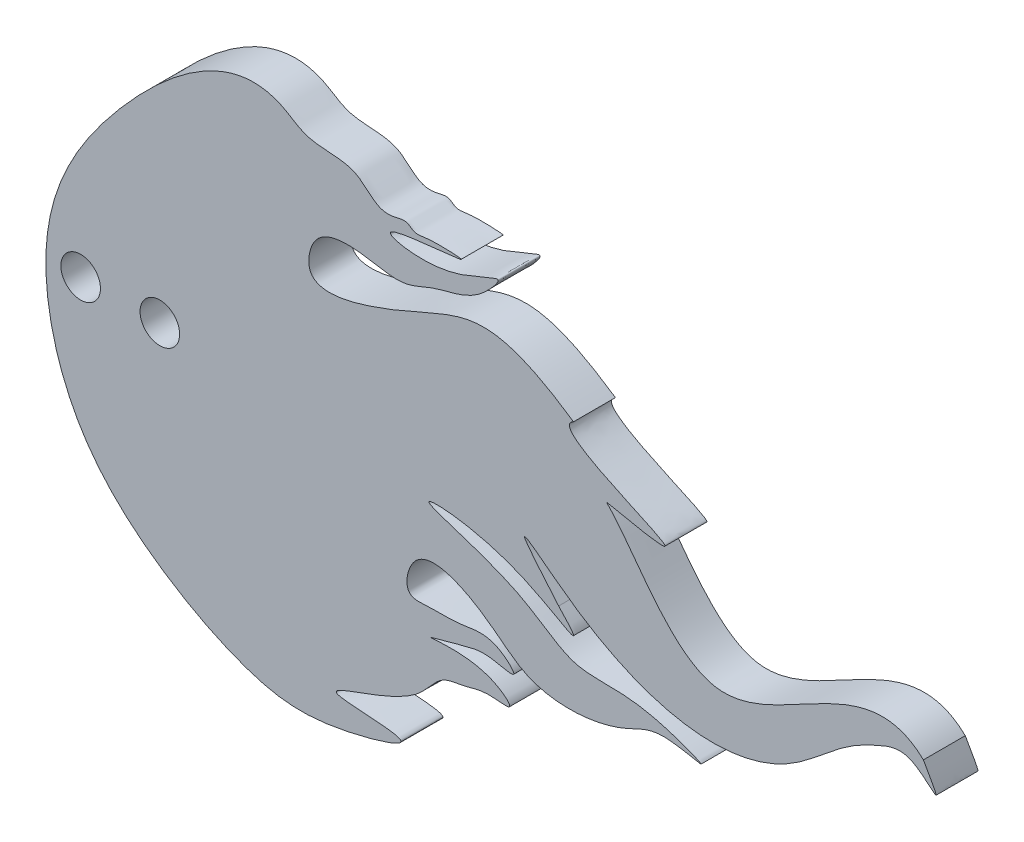
ISO-10303-21;
HEADER;
FILE_DESCRIPTION(('STEP AP214'),'2;1');
FILE_NAME('part.step','',(''),(''),'','','');
FILE_SCHEMA(('AUTOMOTIVE_DESIGN { 1 0 10303 214 1 1 1 1 }'));
ENDSEC;
DATA;
#1=APPLICATION_CONTEXT('core data for automotive mechanical design processes');
#2=APPLICATION_PROTOCOL_DEFINITION('international standard','automotive_design',2000,#1);
#3=PRODUCT_CONTEXT('',#1,'mechanical');
#4=PRODUCT('Part','Part','',(#3));
#5=PRODUCT_RELATED_PRODUCT_CATEGORY('part','',(#4));
#6=PRODUCT_DEFINITION_FORMATION('','',#4);
#7=PRODUCT_DEFINITION_CONTEXT('part definition',#1,'design');
#8=PRODUCT_DEFINITION('design','',#6,#7);
#9=PRODUCT_DEFINITION_SHAPE('','',#8);
#10=(LENGTH_UNIT() NAMED_UNIT(*) SI_UNIT(.MILLI.,.METRE.));
#11=(NAMED_UNIT(*) PLANE_ANGLE_UNIT() SI_UNIT($,.RADIAN.));
#12=(NAMED_UNIT(*) SI_UNIT($,.STERADIAN.) SOLID_ANGLE_UNIT());
#13=UNCERTAINTY_MEASURE_WITH_UNIT(LENGTH_MEASURE(1.E-05),#10,'distance_accuracy_value','');
#14=(GEOMETRIC_REPRESENTATION_CONTEXT(3) GLOBAL_UNCERTAINTY_ASSIGNED_CONTEXT((#13)) GLOBAL_UNIT_ASSIGNED_CONTEXT((#10,
#11,#12)) REPRESENTATION_CONTEXT('',''));
#15=CARTESIAN_POINT('',(0.,0.,0.));
#16=DIRECTION('',(0.,0.,1.));
#17=DIRECTION('',(1.,0.,0.));
#18=AXIS2_PLACEMENT_3D('',#15,#16,#17);
#19=CARTESIAN_POINT('',(41.3549220080931,31.0230299699767,3.175));
#20=CARTESIAN_POINT('',(33.9720440539472,36.0530782339666,3.175));
#21=CARTESIAN_POINT('',(32.2977858198941,32.3565667105754,3.175));
#22=CARTESIAN_POINT('',(20.7696091372768,29.4457621228848,3.175));
#23=CARTESIAN_POINT('',(21.67810284336,34.2387747048186,3.175));
#24=CARTESIAN_POINT('',(25.4705528282111,34.1586736266601,3.175));
#25=CARTESIAN_POINT('',(28.3802173133292,33.367358419093,3.175));
#26=CARTESIAN_POINT('',(31.2449201130264,34.8743214604512,3.175));
#27=CARTESIAN_POINT('',(33.7163564911668,34.9731184821858,3.175));
#28=CARTESIAN_POINT('',(36.7189586217149,38.5150338629654,3.175));
#29=CARTESIAN_POINT('',(31.9136759152894,35.1994476442837,3.175));
#30=CARTESIAN_POINT('',(23.840142357921,36.8363912281645,3.175));
#31=CARTESIAN_POINT('',(35.2317906731922,37.3958661374964,3.175));
#32=CARTESIAN_POINT('',(31.1121299670091,37.5731809720246,3.175));
#33=CARTESIAN_POINT('',(30.0870459585164,37.4927941471804,3.175));
#34=CARTESIAN_POINT('',(29.262914377226,37.3512130056213,3.175));
#35=CARTESIAN_POINT('',(28.7032376060159,37.9507838012107,3.175));
#36=CARTESIAN_POINT('',(27.8129680444021,37.63302882079,3.175));
#37=CARTESIAN_POINT('',(26.3919079587829,37.5724257438123,3.175));
#38=CARTESIAN_POINT('',(24.705374407945,39.8739670695336,3.175));
#39=CARTESIAN_POINT('',(21.5600526992188,39.0979909637939,3.175));
#40=CARTESIAN_POINT('',(16.0399752336877,43.3008027237849,3.175));
#41=CARTESIAN_POINT('',(5.89122312531113,34.5285652229111,3.175));
#42=CARTESIAN_POINT('',(-0.00240369593507275,23.7599733988015,3.175));
#43=CARTESIAN_POINT('',(2.85710311505319,11.8466909848685,3.175));
#44=CARTESIAN_POINT('',(9.70473696119852,5.59672963324414,3.175));
#45=CARTESIAN_POINT('',(17.316174360177,1.75354544030165,3.175));
#46=CARTESIAN_POINT('',(22.2736770865761,1.38042875022355,3.175));
#47=CARTESIAN_POINT('',(31.0703199080442,3.99661371001944,3.175));
#48=CARTESIAN_POINT('',(19.0096039411179,3.86886350999444,3.175));
#49=CARTESIAN_POINT('',(29.5744389498898,5.9489149230017,3.175));
#50=CARTESIAN_POINT('',(30.9822049992327,9.26964092371762,3.175));
#51=CARTESIAN_POINT('',(33.3009773503853,9.5034118260375,3.175));
#52=CARTESIAN_POINT('',(34.516397419071,10.0919151066659,3.175));
#53=CARTESIAN_POINT('',(37.1849027171738,9.58748141397212,3.175));
#54=CARTESIAN_POINT('',(34.1781713021411,12.1713205237161,3.175));
#55=CARTESIAN_POINT('',(28.4735499304611,10.9559290241157,3.175));
#56=CARTESIAN_POINT('',(33.215600837273,12.1927392507583,3.175));
#57=CARTESIAN_POINT('',(34.6396195638015,12.6177611472723,3.175));
#58=CARTESIAN_POINT('',(37.5011996664773,11.7934793707428,3.175));
#59=CARTESIAN_POINT('',(35.1052175920869,14.0541095439786,3.175));
#60=CARTESIAN_POINT('',(32.9243821249428,13.3096666432512,3.175));
#61=CARTESIAN_POINT('',(30.7903087589449,13.4499512962252,3.175));
#62=CARTESIAN_POINT('',(28.4194046228156,13.210471391216,3.175));
#63=CARTESIAN_POINT('',(29.2366405608638,17.7622030526873,3.175));
#64=CARTESIAN_POINT('',(34.6630047098513,15.2421855193383,3.175));
#65=CARTESIAN_POINT('',(38.3124610902389,11.5137679732903,3.175));
#66=CARTESIAN_POINT('',(44.2412164561711,11.9898140679571,3.175));
#67=CARTESIAN_POINT('',(47.7063494970929,14.2404051161629,3.175));
#68=CARTESIAN_POINT('',(52.9856164055338,12.7289828090862,3.175));
#69=CARTESIAN_POINT('',(45.6940885031656,15.6237018375215,3.175));
#70=CARTESIAN_POINT('',(41.4365579407384,14.3915709918011,3.175));
#71=CARTESIAN_POINT('',(37.1402076469705,18.3887441245213,3.175));
#72=CARTESIAN_POINT('',(26.6610542955725,20.8177272345052,3.175));
#73=CARTESIAN_POINT('',(37.2288003692225,20.1929252837264,3.175));
#74=CARTESIAN_POINT('',(42.9710442433009,15.479813331642,3.175));
#75=CARTESIAN_POINT('',(40.2270863242686,18.3679304480101,3.175));
#76=B_SPLINE_CURVE_WITH_KNOTS('',3,(#19,#20,#21,#22,#23,#24,#25,#26,#27,#28,#29,#30,#31,#32,#33,
#34,#35,#36,#37,#38,#39,#40,#41,#42,#43,#44,#45,#46,#47,#48,#49,#50,#51,#52,#53,#54,#55,#56,#57,
#58,#59,#60,#61,#62,#63,#64,#65,#66,#67,#68,#69,#70,#71,#72,#73,#74,#75),.UNSPECIFIED.,.F.,.F.,
(4,1,1,1,1,1,1,1,1,1,1,1,1,1,1,1,1,1,1,1,1,1,1,1,1,1,1,1,1,1,1,1,1,1,1,1,1,1,1,1,1,1,1,1,1,1,1,
1,1,1,1,1,1,1,4),(0.,0.0684601973403676,0.0896618004127666,0.0987865660196648,0.115937564923483,
0.128955727329369,0.138030154691066,0.155343597620779,0.163568502325599,0.180092593587653,
0.199293826955547,0.222145101348247,0.230007495519871,0.234460379079716,0.237192543711568,
0.239945970645665,0.243718188735315,0.248157956262074,0.257726629111863,0.275475844929727,
0.283271197093495,0.343295321312501,0.398607826843988,0.44746178860544,0.485376725896982,
0.517756407078956,0.550202659509143,0.566951101693784,0.587623678328057,0.616337821988977,
0.629639599163534,0.634529429702818,0.644243274021475,0.650390644443143,0.657169634376159,
0.67779985202193,0.688073890021199,0.698710488006074,0.70523522950607,0.711514008956197,
0.724872659635733,0.735123967434592,0.7409698580955,0.74987562521519,0.773640157464158,
0.79031531722918,0.82311729768206,0.835056995305444,0.848084071875145,0.865797108395871,
0.890761749123011,0.912394253473049,0.94277423188536,0.972648987323706,1.),.UNSPECIFIED.);
#77=DIRECTION('',(0.,0.,-1.));
#78=VECTOR('',#77,1.);
#79=SURFACE_OF_LINEAR_EXTRUSION('',#76,#78);
#80=CARTESIAN_POINT('',(41.3549220080931,31.0230299699767,0.));
#81=CARTESIAN_POINT('',(33.9720440539472,36.0530782339666,0.));
#82=CARTESIAN_POINT('',(32.2977858198941,32.3565667105754,0.));
#83=CARTESIAN_POINT('',(20.7696091372768,29.4457621228848,0.));
#84=CARTESIAN_POINT('',(21.67810284336,34.2387747048186,0.));
#85=CARTESIAN_POINT('',(25.4705528282111,34.1586736266601,0.));
#86=CARTESIAN_POINT('',(28.3802173133292,33.367358419093,0.));
#87=CARTESIAN_POINT('',(31.2449201130264,34.8743214604512,0.));
#88=CARTESIAN_POINT('',(33.7163564911668,34.9731184821858,0.));
#89=CARTESIAN_POINT('',(36.7189586217149,38.5150338629654,0.));
#90=CARTESIAN_POINT('',(31.9136759152894,35.1994476442837,0.));
#91=CARTESIAN_POINT('',(23.840142357921,36.8363912281645,0.));
#92=CARTESIAN_POINT('',(35.2317906731922,37.3958661374964,0.));
#93=CARTESIAN_POINT('',(31.1121299670091,37.5731809720246,0.));
#94=CARTESIAN_POINT('',(30.0870459585164,37.4927941471804,0.));
#95=CARTESIAN_POINT('',(29.262914377226,37.3512130056213,0.));
#96=CARTESIAN_POINT('',(28.7032376060159,37.9507838012107,0.));
#97=CARTESIAN_POINT('',(27.8129680444021,37.63302882079,0.));
#98=CARTESIAN_POINT('',(26.3919079587829,37.5724257438123,0.));
#99=CARTESIAN_POINT('',(24.705374407945,39.8739670695336,0.));
#100=CARTESIAN_POINT('',(21.5600526992188,39.0979909637939,0.));
#101=CARTESIAN_POINT('',(16.0399752336877,43.3008027237849,0.));
#102=CARTESIAN_POINT('',(5.89122312531113,34.5285652229111,0.));
#103=CARTESIAN_POINT('',(-0.00240369593507275,23.7599733988015,0.));
#104=CARTESIAN_POINT('',(2.85710311505319,11.8466909848685,0.));
#105=CARTESIAN_POINT('',(9.70473696119852,5.59672963324414,0.));
#106=CARTESIAN_POINT('',(17.316174360177,1.75354544030165,0.));
#107=CARTESIAN_POINT('',(22.2736770865761,1.38042875022355,0.));
#108=CARTESIAN_POINT('',(31.0703199080442,3.99661371001944,0.));
#109=CARTESIAN_POINT('',(19.0096039411179,3.86886350999444,0.));
#110=CARTESIAN_POINT('',(29.5744389498898,5.9489149230017,0.));
#111=CARTESIAN_POINT('',(30.9822049992327,9.26964092371762,0.));
#112=CARTESIAN_POINT('',(33.3009773503853,9.5034118260375,0.));
#113=CARTESIAN_POINT('',(34.516397419071,10.0919151066659,0.));
#114=CARTESIAN_POINT('',(37.1849027171738,9.58748141397212,0.));
#115=CARTESIAN_POINT('',(34.1781713021411,12.1713205237161,0.));
#116=CARTESIAN_POINT('',(28.4735499304611,10.9559290241157,0.));
#117=CARTESIAN_POINT('',(33.215600837273,12.1927392507583,0.));
#118=CARTESIAN_POINT('',(34.6396195638015,12.6177611472723,0.));
#119=CARTESIAN_POINT('',(37.5011996664773,11.7934793707428,0.));
#120=CARTESIAN_POINT('',(35.1052175920869,14.0541095439786,0.));
#121=CARTESIAN_POINT('',(32.9243821249428,13.3096666432512,0.));
#122=CARTESIAN_POINT('',(30.7903087589449,13.4499512962252,0.));
#123=CARTESIAN_POINT('',(28.4194046228156,13.210471391216,0.));
#124=CARTESIAN_POINT('',(29.2366405608638,17.7622030526873,0.));
#125=CARTESIAN_POINT('',(34.6630047098513,15.2421855193383,0.));
#126=CARTESIAN_POINT('',(38.3124610902389,11.5137679732903,0.));
#127=CARTESIAN_POINT('',(44.2412164561711,11.9898140679571,0.));
#128=CARTESIAN_POINT('',(47.7063494970929,14.2404051161629,0.));
#129=CARTESIAN_POINT('',(52.9856164055338,12.7289828090862,0.));
#130=CARTESIAN_POINT('',(45.6940885031656,15.6237018375215,0.));
#131=CARTESIAN_POINT('',(41.4365579407384,14.3915709918011,0.));
#132=CARTESIAN_POINT('',(37.1402076469705,18.3887441245213,0.));
#133=CARTESIAN_POINT('',(26.6610542955725,20.8177272345052,0.));
#134=CARTESIAN_POINT('',(37.2288003692225,20.1929252837264,0.));
#135=CARTESIAN_POINT('',(42.9710442433009,15.479813331642,0.));
#136=CARTESIAN_POINT('',(40.2270863242686,18.3679304480101,0.));
#137=B_SPLINE_CURVE_WITH_KNOTS('',3,(#80,#81,#82,#83,#84,#85,#86,#87,#88,#89,#90,#91,#92,#93,
#94,#95,#96,#97,#98,#99,#100,#101,#102,#103,#104,#105,#106,#107,#108,#109,#110,#111,#112,#113,
#114,#115,#116,#117,#118,#119,#120,#121,#122,#123,#124,#125,#126,#127,#128,#129,#130,#131,#132,
#133,#134,#135,#136),.UNSPECIFIED.,.F.,.F.,(4,1,1,1,1,1,1,1,1,1,1,1,1,1,1,1,1,1,1,1,1,1,1,1,1,1,
1,1,1,1,1,1,1,1,1,1,1,1,1,1,1,1,1,1,1,1,1,1,1,1,1,1,1,1,4),(0.,0.0684601973403676,
0.0896618004127666,0.0987865660196648,0.115937564923483,0.128955727329369,0.138030154691066,
0.155343597620779,0.163568502325599,0.180092593587653,0.199293826955547,0.222145101348247,
0.230007495519871,0.234460379079716,0.237192543711568,0.239945970645665,0.243718188735315,
0.248157956262074,0.257726629111863,0.275475844929727,0.283271197093495,0.343295321312501,
0.398607826843988,0.44746178860544,0.485376725896982,0.517756407078956,0.550202659509143,
0.566951101693784,0.587623678328057,0.616337821988977,0.629639599163534,0.634529429702818,
0.644243274021475,0.650390644443143,0.657169634376159,0.67779985202193,0.688073890021199,
0.698710488006074,0.70523522950607,0.711514008956197,0.724872659635733,0.735123967434592,
0.7409698580955,0.74987562521519,0.773640157464158,0.79031531722918,0.82311729768206,
0.835056995305444,0.848084071875145,0.865797108395871,0.890761749123011,0.912394253473049,
0.94277423188536,0.972648987323706,1.),.UNSPECIFIED.);
#138=CARTESIAN_POINT('',(41.3549220080931,31.0230299699767,0.));
#139=VERTEX_POINT('',#138);
#140=CARTESIAN_POINT('',(40.2270863242686,18.3679304480101,0.));
#141=VERTEX_POINT('',#140);
#142=EDGE_CURVE('E133',#139,#141,#137,.T.);
#143=ORIENTED_EDGE('',*,*,#142,.T.);
#144=DIRECTION('',(0.,0.,-1.));
#145=VECTOR('',#144,1.);
#146=CARTESIAN_POINT('',(40.2270863242686,18.3679304480101,3.175));
#147=LINE('',#146,#145);
#148=CARTESIAN_POINT('',(40.2270863242686,18.3679304480101,3.175));
#149=VERTEX_POINT('',#148);
#150=EDGE_CURVE('E11',#149,#141,#147,.T.);
#151=ORIENTED_EDGE('',*,*,#150,.F.);
#152=CARTESIAN_POINT('',(41.3549220080931,31.0230299699767,3.175));
#153=VERTEX_POINT('',#152);
#154=EDGE_CURVE('E92',#153,#149,#76,.T.);
#155=ORIENTED_EDGE('',*,*,#154,.F.);
#156=DIRECTION('',(0.,0.,-1.));
#157=VECTOR('',#156,1.);
#158=CARTESIAN_POINT('',(41.3549220080931,31.0230299699767,3.175));
#159=LINE('',#158,#157);
#160=EDGE_CURVE('E104',#153,#139,#159,.T.);
#161=ORIENTED_EDGE('',*,*,#160,.T.);
#162=EDGE_LOOP('',(#143,#151,#155,#161));
#163=FACE_BOUND('',#162,.T.);
#164=ADVANCED_FACE('F39',(#163),#79,.F.);
#165=CARTESIAN_POINT('',(40.2270863242686,18.3679304480101,3.175));
#166=CARTESIAN_POINT('',(35.3562145627811,24.0141352773653,3.175));
#167=CARTESIAN_POINT('',(44.2478589440008,15.2774695012866,3.175));
#168=CARTESIAN_POINT('',(55.4749193786125,13.7664528061119,3.175));
#169=CARTESIAN_POINT('',(61.4960323653405,19.9095266768163,3.175));
#170=CARTESIAN_POINT('',(64.4287073809775,21.3719112040398,3.175));
#171=CARTESIAN_POINT('',(67.433162917921,22.4941297257093,3.175));
#172=CARTESIAN_POINT('',(69.9522861055509,18.4637180243281,3.175));
#173=CARTESIAN_POINT('',(67.8735349772595,22.0910911548599,3.175));
#174=B_SPLINE_CURVE_WITH_KNOTS('',3,(#165,#166,#167,#168,#169,#170,#171,#172,#173),
.UNSPECIFIED.,.F.,.F.,(4,1,1,1,1,1,4),(0.,0.213400868727631,0.637108029388846,0.771833064781352,
0.832267145575802,0.886503337745571,1.),.UNSPECIFIED.);
#175=DIRECTION('',(0.,0.,-1.));
#176=VECTOR('',#175,1.);
#177=SURFACE_OF_LINEAR_EXTRUSION('',#174,#176);
#178=CARTESIAN_POINT('',(40.2270863242686,18.3679304480101,0.));
#179=CARTESIAN_POINT('',(35.3562145627811,24.0141352773653,0.));
#180=CARTESIAN_POINT('',(44.2478589440008,15.2774695012866,0.));
#181=CARTESIAN_POINT('',(55.4749193786125,13.7664528061119,0.));
#182=CARTESIAN_POINT('',(61.4960323653405,19.9095266768163,0.));
#183=CARTESIAN_POINT('',(64.4287073809775,21.3719112040398,0.));
#184=CARTESIAN_POINT('',(67.433162917921,22.4941297257093,0.));
#185=CARTESIAN_POINT('',(69.9522861055509,18.4637180243281,0.));
#186=CARTESIAN_POINT('',(67.8735349772595,22.0910911548599,0.));
#187=B_SPLINE_CURVE_WITH_KNOTS('',3,(#178,#179,#180,#181,#182,#183,#184,#185,#186),
.UNSPECIFIED.,.F.,.F.,(4,1,1,1,1,1,4),(0.,0.213400868727631,0.637108029388846,0.771833064781352,
0.832267145575802,0.886503337745571,1.),.UNSPECIFIED.);
#188=CARTESIAN_POINT('',(67.8735349772595,22.0910911548599,0.));
#189=VERTEX_POINT('',#188);
#190=EDGE_CURVE('E97',#141,#189,#187,.T.);
#191=ORIENTED_EDGE('',*,*,#190,.T.);
#192=DIRECTION('',(0.,0.,-1.));
#193=VECTOR('',#192,1.);
#194=CARTESIAN_POINT('',(67.8735349772595,22.0910911548599,3.175));
#195=LINE('',#194,#193);
#196=CARTESIAN_POINT('',(67.8735349772595,22.0910911548599,3.175));
#197=VERTEX_POINT('',#196);
#198=EDGE_CURVE('E49',#197,#189,#195,.T.);
#199=ORIENTED_EDGE('',*,*,#198,.F.);
#200=EDGE_CURVE('E87',#149,#197,#174,.T.);
#201=ORIENTED_EDGE('',*,*,#200,.F.);
#202=ORIENTED_EDGE('',*,*,#150,.T.);
#203=EDGE_LOOP('',(#191,#199,#201,#202));
#204=FACE_BOUND('',#203,.T.);
#205=ADVANCED_FACE('F96',(#204),#177,.F.);
#206=CARTESIAN_POINT('',(67.8735349772595,22.0910911548599,3.175));
#207=CARTESIAN_POINT('',(63.2921729687892,26.4733882313686,3.175));
#208=CARTESIAN_POINT('',(52.3173917307018,12.2333396150776,3.175));
#209=CARTESIAN_POINT('',(46.0039695558674,24.8762261538136,3.175));
#210=CARTESIAN_POINT('',(43.8486676415864,27.0053286715708,3.175));
#211=B_SPLINE_CURVE_WITH_KNOTS('',3,(#206,#207,#208,#209,#210),.UNSPECIFIED.,.F.,.F.,(4,1,4),
(0.,0.58120905312346,1.),.UNSPECIFIED.);
#212=DIRECTION('',(0.,0.,-1.));
#213=VECTOR('',#212,1.);
#214=SURFACE_OF_LINEAR_EXTRUSION('',#211,#213);
#215=CARTESIAN_POINT('',(67.8735349772595,22.0910911548599,0.));
#216=CARTESIAN_POINT('',(63.2921729687892,26.4733882313686,0.));
#217=CARTESIAN_POINT('',(52.3173917307018,12.2333396150776,0.));
#218=CARTESIAN_POINT('',(46.0039695558674,24.8762261538136,0.));
#219=CARTESIAN_POINT('',(43.8486676415864,27.0053286715708,0.));
#220=B_SPLINE_CURVE_WITH_KNOTS('',3,(#215,#216,#217,#218,#219),.UNSPECIFIED.,.F.,.F.,(4,1,4),
(0.,0.58120905312346,1.),.UNSPECIFIED.);
#221=CARTESIAN_POINT('',(43.8486676415864,27.0053286715708,0.));
#222=VERTEX_POINT('',#221);
#223=EDGE_CURVE('E74',#189,#222,#220,.T.);
#224=ORIENTED_EDGE('',*,*,#223,.T.);
#225=DIRECTION('',(0.,0.,-1.));
#226=VECTOR('',#225,1.);
#227=CARTESIAN_POINT('',(43.8486676415864,27.0053286715708,3.175));
#228=LINE('',#227,#226);
#229=CARTESIAN_POINT('',(43.8486676415864,27.0053286715708,3.175));
#230=VERTEX_POINT('',#229);
#231=EDGE_CURVE('E99',#230,#222,#228,.T.);
#232=ORIENTED_EDGE('',*,*,#231,.F.);
#233=EDGE_CURVE('E90',#197,#230,#211,.T.);
#234=ORIENTED_EDGE('',*,*,#233,.F.);
#235=ORIENTED_EDGE('',*,*,#198,.T.);
#236=EDGE_LOOP('',(#224,#232,#234,#235));
#237=FACE_BOUND('',#236,.T.);
#238=ADVANCED_FACE('F100',(#237),#214,.F.);
#239=CARTESIAN_POINT('',(43.8486676415864,27.0053286715708,3.175));
#240=CARTESIAN_POINT('',(56.1974486244649,24.3516582056107,3.175));
#241=CARTESIAN_POINT('',(38.5474976485595,29.5999623001538,3.175));
#242=CARTESIAN_POINT('',(41.3549220080931,31.0230299699767,3.175));
#243=B_SPLINE_CURVE_WITH_KNOTS('',3,(#239,#240,#241,#242),.UNSPECIFIED.,.F.,.F.,(4,4),(0.,1.),.UNSPECIFIED.);
#244=DIRECTION('',(0.,0.,-1.));
#245=VECTOR('',#244,1.);
#246=SURFACE_OF_LINEAR_EXTRUSION('',#243,#245);
#247=CARTESIAN_POINT('',(43.8486676415864,27.0053286715708,0.));
#248=CARTESIAN_POINT('',(56.1974486244649,24.3516582056107,0.));
#249=CARTESIAN_POINT('',(38.5474976485595,29.5999623001538,0.));
#250=CARTESIAN_POINT('',(41.3549220080931,31.0230299699767,0.));
#251=B_SPLINE_CURVE_WITH_KNOTS('',3,(#247,#248,#249,#250),.UNSPECIFIED.,.F.,.F.,(4,4),(0.,1.),.UNSPECIFIED.);
#252=EDGE_CURVE('E80',#222,#139,#251,.T.);
#253=ORIENTED_EDGE('',*,*,#252,.T.);
#254=ORIENTED_EDGE('',*,*,#160,.F.);
#255=EDGE_CURVE('E57',#230,#153,#243,.T.);
#256=ORIENTED_EDGE('',*,*,#255,.F.);
#257=ORIENTED_EDGE('',*,*,#231,.T.);
#258=EDGE_LOOP('',(#253,#254,#256,#257));
#259=FACE_BOUND('',#258,.T.);
#260=ADVANCED_FACE('F122',(#259),#246,.F.);
#261=CARTESIAN_POINT('',(13.3858849565505,3.83458122085335,3.175));
#262=DIRECTION('',(0.,0.,1.));
#263=DIRECTION('',(1.,0.,0.));
#264=AXIS2_PLACEMENT_3D('',#261,#262,#263);
#265=PLANE('',#264);
#266=CARTESIAN_POINT('',(4.,21.8382228630262,3.175));
#267=DIRECTION('',(0.,0.,1.));
#268=DIRECTION('',(1.,0.,0.));
#269=AXIS2_PLACEMENT_3D('',#266,#267,#268);
#270=CIRCLE('',#269,1.5);
#271=CARTESIAN_POINT('',(5.5,21.8382228630262,3.175));
#272=VERTEX_POINT('',#271);
#273=EDGE_CURVE('E141',#272,#272,#270,.T.);
#274=ORIENTED_EDGE('',*,*,#273,.F.);
#275=EDGE_LOOP('',(#274));
#276=FACE_BOUND('',#275,.T.);
#277=CARTESIAN_POINT('',(10.,21.8382228630262,3.175));
#278=DIRECTION('',(0.,0.,1.));
#279=DIRECTION('',(1.,0.,0.));
#280=AXIS2_PLACEMENT_3D('',#277,#278,#279);
#281=CIRCLE('',#280,1.5);
#282=CARTESIAN_POINT('',(11.5,21.8382228630262,3.175));
#283=VERTEX_POINT('',#282);
#284=EDGE_CURVE('E199',#283,#283,#281,.T.);
#285=ORIENTED_EDGE('',*,*,#284,.F.);
#286=EDGE_LOOP('',(#285));
#287=FACE_BOUND('',#286,.T.);
#288=ORIENTED_EDGE('',*,*,#154,.T.);
#289=ORIENTED_EDGE('',*,*,#200,.T.);
#290=ORIENTED_EDGE('',*,*,#233,.T.);
#291=ORIENTED_EDGE('',*,*,#255,.T.);
#292=EDGE_LOOP('',(#288,#289,#290,#291));
#293=FACE_BOUND('',#292,.T.);
#294=ADVANCED_FACE('F88',(#276,#287,#293),#265,.T.);
#295=CARTESIAN_POINT('',(13.3858849565505,3.83458122085335,0.));
#296=DIRECTION('',(0.,0.,1.));
#297=DIRECTION('',(1.,0.,0.));
#298=AXIS2_PLACEMENT_3D('',#295,#296,#297);
#299=PLANE('',#298);
#300=CARTESIAN_POINT('',(4.,21.8382228630262,0.));
#301=DIRECTION('',(0.,0.,1.));
#302=DIRECTION('',(1.,0.,0.));
#303=AXIS2_PLACEMENT_3D('',#300,#301,#302);
#304=CIRCLE('',#303,1.5);
#305=CARTESIAN_POINT('',(5.5,21.8382228630262,0.));
#306=VERTEX_POINT('',#305);
#307=EDGE_CURVE('E136',#306,#306,#304,.T.);
#308=ORIENTED_EDGE('',*,*,#307,.T.);
#309=EDGE_LOOP('',(#308));
#310=FACE_BOUND('',#309,.T.);
#311=CARTESIAN_POINT('',(10.,21.8382228630262,0.));
#312=DIRECTION('',(0.,0.,1.));
#313=DIRECTION('',(1.,0.,0.));
#314=AXIS2_PLACEMENT_3D('',#311,#312,#313);
#315=CIRCLE('',#314,1.5);
#316=CARTESIAN_POINT('',(11.5,21.8382228630262,0.));
#317=VERTEX_POINT('',#316);
#318=EDGE_CURVE('E195',#317,#317,#315,.T.);
#319=ORIENTED_EDGE('',*,*,#318,.T.);
#320=EDGE_LOOP('',(#319));
#321=FACE_BOUND('',#320,.T.);
#322=ORIENTED_EDGE('',*,*,#142,.F.);
#323=ORIENTED_EDGE('',*,*,#252,.F.);
#324=ORIENTED_EDGE('',*,*,#223,.F.);
#325=ORIENTED_EDGE('',*,*,#190,.F.);
#326=EDGE_LOOP('',(#322,#323,#324,#325));
#327=FACE_BOUND('',#326,.T.);
#328=ADVANCED_FACE('F171',(#310,#321,#327),#299,.F.);
#329=CARTESIAN_POINT('',(10.,21.8382228630262,0.));
#330=DIRECTION('',(0.,0.,1.));
#331=DIRECTION('',(1.,0.,0.));
#332=AXIS2_PLACEMENT_3D('',#329,#330,#331);
#333=CYLINDRICAL_SURFACE('',#332,1.5);
#334=ORIENTED_EDGE('',*,*,#318,.F.);
#335=EDGE_LOOP('',(#334));
#336=FACE_BOUND('',#335,.T.);
#337=ORIENTED_EDGE('',*,*,#284,.T.);
#338=EDGE_LOOP('',(#337));
#339=FACE_BOUND('',#338,.T.);
#340=ADVANCED_FACE('F173',(#336,#339),#333,.F.);
#341=CARTESIAN_POINT('',(4.,21.8382228630262,0.));
#342=DIRECTION('',(0.,0.,1.));
#343=DIRECTION('',(1.,0.,0.));
#344=AXIS2_PLACEMENT_3D('',#341,#342,#343);
#345=CYLINDRICAL_SURFACE('',#344,1.5);
#346=ORIENTED_EDGE('',*,*,#307,.F.);
#347=EDGE_LOOP('',(#346));
#348=FACE_BOUND('',#347,.T.);
#349=ORIENTED_EDGE('',*,*,#273,.T.);
#350=EDGE_LOOP('',(#349));
#351=FACE_BOUND('',#350,.T.);
#352=ADVANCED_FACE('F179',(#348,#351),#345,.F.);
#353=CLOSED_SHELL('',(#164,#205,#238,#260,#294,#328,#340,#352));
#354=MANIFOLD_SOLID_BREP('B2',#353);
#355=ADVANCED_BREP_SHAPE_REPRESENTATION('',(#18,#354),#14);
#356=SHAPE_DEFINITION_REPRESENTATION(#9,#355);
ENDSEC;
END-ISO-10303-21;
